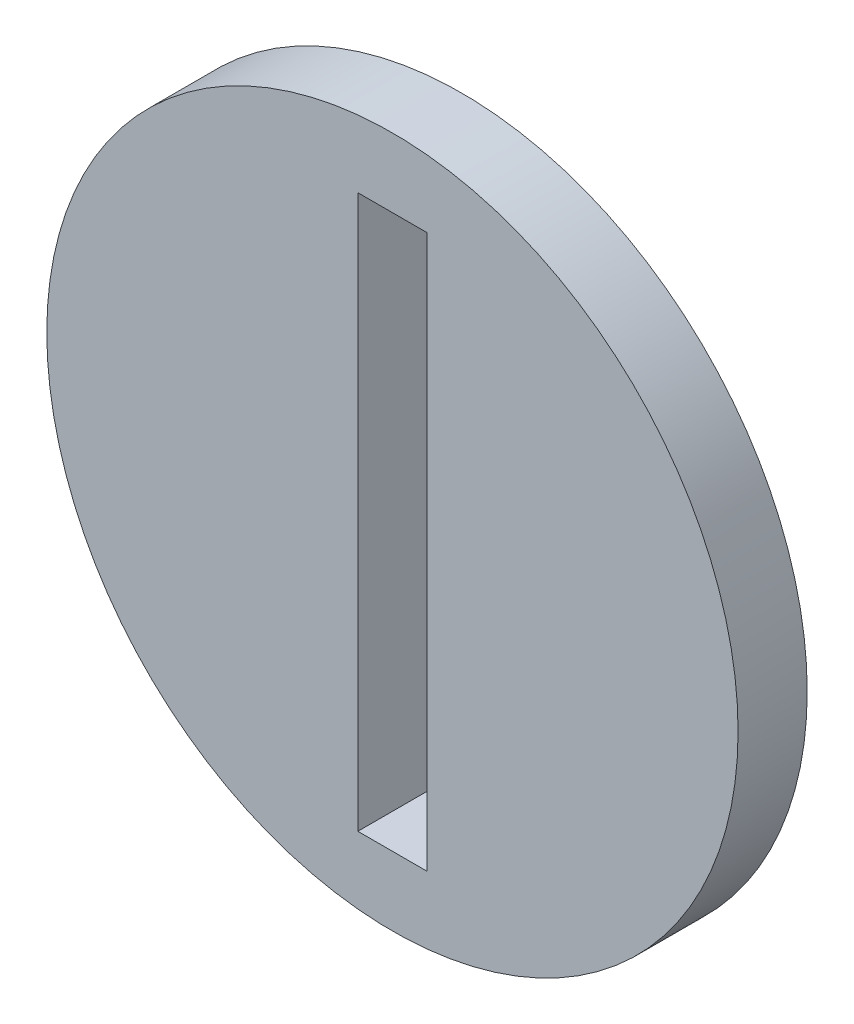
ISO-10303-21;
HEADER;
FILE_DESCRIPTION(('STEP AP214'),'2;1');
FILE_NAME('part.step','',(''),(''),'','','');
FILE_SCHEMA(('AUTOMOTIVE_DESIGN { 1 0 10303 214 1 1 1 1 }'));
ENDSEC;
DATA;
#1=APPLICATION_CONTEXT('core data for automotive mechanical design processes');
#2=APPLICATION_PROTOCOL_DEFINITION('international standard','automotive_design',2000,#1);
#3=PRODUCT_CONTEXT('',#1,'mechanical');
#4=PRODUCT('Part','Part','',(#3));
#5=PRODUCT_RELATED_PRODUCT_CATEGORY('part','',(#4));
#6=PRODUCT_DEFINITION_FORMATION('','',#4);
#7=PRODUCT_DEFINITION_CONTEXT('part definition',#1,'design');
#8=PRODUCT_DEFINITION('design','',#6,#7);
#9=PRODUCT_DEFINITION_SHAPE('','',#8);
#10=(LENGTH_UNIT() NAMED_UNIT(*) SI_UNIT(.MILLI.,.METRE.));
#11=(NAMED_UNIT(*) PLANE_ANGLE_UNIT() SI_UNIT($,.RADIAN.));
#12=(NAMED_UNIT(*) SI_UNIT($,.STERADIAN.) SOLID_ANGLE_UNIT());
#13=UNCERTAINTY_MEASURE_WITH_UNIT(LENGTH_MEASURE(1.E-05),#10,'distance_accuracy_value','');
#14=(GEOMETRIC_REPRESENTATION_CONTEXT(3) GLOBAL_UNCERTAINTY_ASSIGNED_CONTEXT((#13)) GLOBAL_UNIT_ASSIGNED_CONTEXT((#10,
#11,#12)) REPRESENTATION_CONTEXT('',''));
#15=CARTESIAN_POINT('',(0.,0.,0.));
#16=DIRECTION('',(0.,0.,1.));
#17=DIRECTION('',(1.,0.,0.));
#18=AXIS2_PLACEMENT_3D('',#15,#16,#17);
#19=CARTESIAN_POINT('',(0.,0.,3.175));
#20=DIRECTION('',(0.,0.,1.));
#21=DIRECTION('',(1.,0.,0.));
#22=AXIS2_PLACEMENT_3D('',#19,#20,#21);
#23=PLANE('',#22);
#24=CARTESIAN_POINT('',(0.,0.,3.175));
#25=DIRECTION('',(0.,0.,1.));
#26=DIRECTION('',(1.,0.,0.));
#27=AXIS2_PLACEMENT_3D('',#24,#25,#26);
#28=CIRCLE('',#27,15.875);
#29=CARTESIAN_POINT('',(15.875,0.,3.175));
#30=VERTEX_POINT('',#29);
#31=EDGE_CURVE('E11',#30,#30,#28,.T.);
#32=ORIENTED_EDGE('',*,*,#31,.T.);
#33=EDGE_LOOP('',(#32));
#34=FACE_BOUND('',#33,.T.);
#35=DIRECTION('',(1.,0.,0.));
#36=VECTOR('',#35,1.);
#37=CARTESIAN_POINT('',(-1.58749999999999,-12.7,3.175));
#38=LINE('',#37,#36);
#39=CARTESIAN_POINT('',(-1.58749999999999,-12.7,3.175));
#40=VERTEX_POINT('',#39);
#41=CARTESIAN_POINT('',(1.5875,-12.7,3.175));
#42=VERTEX_POINT('',#41);
#43=EDGE_CURVE('E83',#40,#42,#38,.T.);
#44=ORIENTED_EDGE('',*,*,#43,.F.);
#45=DIRECTION('',(0.,-1.,0.));
#46=VECTOR('',#45,1.);
#47=CARTESIAN_POINT('',(-1.58750000000001,12.7,3.175));
#48=LINE('',#47,#46);
#49=CARTESIAN_POINT('',(-1.58750000000001,12.7,3.175));
#50=VERTEX_POINT('',#49);
#51=EDGE_CURVE('E75',#50,#40,#48,.T.);
#52=ORIENTED_EDGE('',*,*,#51,.F.);
#53=DIRECTION('',(-1.,0.,0.));
#54=VECTOR('',#53,1.);
#55=CARTESIAN_POINT('',(-1.58750000000001,12.7,3.175));
#56=LINE('',#55,#54);
#57=CARTESIAN_POINT('',(1.5875,12.7,3.175));
#58=VERTEX_POINT('',#57);
#59=EDGE_CURVE('E96',#58,#50,#56,.T.);
#60=ORIENTED_EDGE('',*,*,#59,.F.);
#61=DIRECTION('',(0.,1.,0.));
#62=VECTOR('',#61,1.);
#63=CARTESIAN_POINT('',(1.5875,12.7,3.175));
#64=LINE('',#63,#62);
#65=EDGE_CURVE('E94',#42,#58,#64,.T.);
#66=ORIENTED_EDGE('',*,*,#65,.F.);
#67=EDGE_LOOP('',(#44,#52,#60,#66));
#68=FACE_BOUND('',#67,.T.);
#69=ADVANCED_FACE('F34',(#34,#68),#23,.T.);
#70=CARTESIAN_POINT('',(0.,0.,0.));
#71=DIRECTION('',(0.,0.,1.));
#72=DIRECTION('',(1.,0.,0.));
#73=AXIS2_PLACEMENT_3D('',#70,#71,#72);
#74=PLANE('',#73);
#75=CARTESIAN_POINT('',(0.,0.,0.));
#76=DIRECTION('',(0.,0.,1.));
#77=DIRECTION('',(1.,0.,0.));
#78=AXIS2_PLACEMENT_3D('',#75,#76,#77);
#79=CIRCLE('',#78,15.875);
#80=CARTESIAN_POINT('',(15.875,0.,0.));
#81=VERTEX_POINT('',#80);
#82=EDGE_CURVE('E38',#81,#81,#79,.T.);
#83=ORIENTED_EDGE('',*,*,#82,.F.);
#84=EDGE_LOOP('',(#83));
#85=FACE_BOUND('',#84,.T.);
#86=DIRECTION('',(0.,-1.,0.));
#87=VECTOR('',#86,1.);
#88=CARTESIAN_POINT('',(-1.58750000000001,12.7,0.));
#89=LINE('',#88,#87);
#90=CARTESIAN_POINT('',(-1.58750000000001,12.7,0.));
#91=VERTEX_POINT('',#90);
#92=CARTESIAN_POINT('',(-1.58749999999999,-12.7,0.));
#93=VERTEX_POINT('',#92);
#94=EDGE_CURVE('E57',#91,#93,#89,.T.);
#95=ORIENTED_EDGE('',*,*,#94,.T.);
#96=DIRECTION('',(1.,0.,0.));
#97=VECTOR('',#96,1.);
#98=CARTESIAN_POINT('',(-1.58749999999999,-12.7,0.));
#99=LINE('',#98,#97);
#100=CARTESIAN_POINT('',(1.5875,-12.7,0.));
#101=VERTEX_POINT('',#100);
#102=EDGE_CURVE('E90',#93,#101,#99,.T.);
#103=ORIENTED_EDGE('',*,*,#102,.T.);
#104=DIRECTION('',(0.,1.,0.));
#105=VECTOR('',#104,1.);
#106=CARTESIAN_POINT('',(1.5875,12.7,0.));
#107=LINE('',#106,#105);
#108=CARTESIAN_POINT('',(1.5875,12.7,0.));
#109=VERTEX_POINT('',#108);
#110=EDGE_CURVE('E102',#101,#109,#107,.T.);
#111=ORIENTED_EDGE('',*,*,#110,.T.);
#112=DIRECTION('',(-1.,0.,0.));
#113=VECTOR('',#112,1.);
#114=CARTESIAN_POINT('',(-1.58750000000001,12.7,0.));
#115=LINE('',#114,#113);
#116=EDGE_CURVE('E84',#109,#91,#115,.T.);
#117=ORIENTED_EDGE('',*,*,#116,.T.);
#118=EDGE_LOOP('',(#95,#103,#111,#117));
#119=FACE_BOUND('',#118,.T.);
#120=ADVANCED_FACE('F113',(#85,#119),#74,.F.);
#121=CARTESIAN_POINT('',(0.,0.,3.175));
#122=DIRECTION('',(0.,0.,-1.));
#123=DIRECTION('',(-1.,0.,0.));
#124=AXIS2_PLACEMENT_3D('',#121,#122,#123);
#125=CYLINDRICAL_SURFACE('',#124,15.875);
#126=ORIENTED_EDGE('',*,*,#31,.F.);
#127=EDGE_LOOP('',(#126));
#128=FACE_BOUND('',#127,.T.);
#129=ORIENTED_EDGE('',*,*,#82,.T.);
#130=EDGE_LOOP('',(#129));
#131=FACE_BOUND('',#130,.T.);
#132=ADVANCED_FACE('F36',(#128,#131),#125,.T.);
#133=CARTESIAN_POINT('',(-1.58750000000001,12.7,3.175));
#134=DIRECTION('',(1.,0.,0.));
#135=DIRECTION('',(0.,1.,0.));
#136=AXIS2_PLACEMENT_3D('',#133,#134,#135);
#137=PLANE('',#136);
#138=ORIENTED_EDGE('',*,*,#94,.F.);
#139=DIRECTION('',(0.,0.,-1.));
#140=VECTOR('',#139,1.);
#141=CARTESIAN_POINT('',(-1.58750000000001,12.7,3.175));
#142=LINE('',#141,#140);
#143=EDGE_CURVE('E79',#50,#91,#142,.T.);
#144=ORIENTED_EDGE('',*,*,#143,.F.);
#145=ORIENTED_EDGE('',*,*,#51,.T.);
#146=DIRECTION('',(0.,0.,-1.));
#147=VECTOR('',#146,1.);
#148=CARTESIAN_POINT('',(-1.58749999999999,-12.7,3.175));
#149=LINE('',#148,#147);
#150=EDGE_CURVE('E78',#40,#93,#149,.T.);
#151=ORIENTED_EDGE('',*,*,#150,.T.);
#152=EDGE_LOOP('',(#138,#144,#145,#151));
#153=FACE_BOUND('',#152,.T.);
#154=ADVANCED_FACE('F77',(#153),#137,.T.);
#155=CARTESIAN_POINT('',(-1.58749999999999,-12.7,3.175));
#156=DIRECTION('',(0.,1.,0.));
#157=DIRECTION('',(0.,0.,1.));
#158=AXIS2_PLACEMENT_3D('',#155,#156,#157);
#159=PLANE('',#158);
#160=ORIENTED_EDGE('',*,*,#102,.F.);
#161=ORIENTED_EDGE('',*,*,#150,.F.);
#162=ORIENTED_EDGE('',*,*,#43,.T.);
#163=DIRECTION('',(0.,0.,-1.));
#164=VECTOR('',#163,1.);
#165=CARTESIAN_POINT('',(1.5875,-12.7,3.175));
#166=LINE('',#165,#164);
#167=EDGE_CURVE('E91',#42,#101,#166,.T.);
#168=ORIENTED_EDGE('',*,*,#167,.T.);
#169=EDGE_LOOP('',(#160,#161,#162,#168));
#170=FACE_BOUND('',#169,.T.);
#171=ADVANCED_FACE('F87',(#170),#159,.T.);
#172=CARTESIAN_POINT('',(1.5875,12.7,3.175));
#173=DIRECTION('',(-1.,0.,0.));
#174=DIRECTION('',(0.,0.,1.));
#175=AXIS2_PLACEMENT_3D('',#172,#173,#174);
#176=PLANE('',#175);
#177=ORIENTED_EDGE('',*,*,#110,.F.);
#178=ORIENTED_EDGE('',*,*,#167,.F.);
#179=ORIENTED_EDGE('',*,*,#65,.T.);
#180=DIRECTION('',(0.,0.,-1.));
#181=VECTOR('',#180,1.);
#182=CARTESIAN_POINT('',(1.5875,12.7,3.175));
#183=LINE('',#182,#181);
#184=EDGE_CURVE('E49',#58,#109,#183,.T.);
#185=ORIENTED_EDGE('',*,*,#184,.T.);
#186=EDGE_LOOP('',(#177,#178,#179,#185));
#187=FACE_BOUND('',#186,.T.);
#188=ADVANCED_FACE('F111',(#187),#176,.T.);
#189=CARTESIAN_POINT('',(-1.58750000000001,12.7,3.175));
#190=DIRECTION('',(0.,-1.,0.));
#191=DIRECTION('',(1.,0.,0.));
#192=AXIS2_PLACEMENT_3D('',#189,#190,#191);
#193=PLANE('',#192);
#194=ORIENTED_EDGE('',*,*,#116,.F.);
#195=ORIENTED_EDGE('',*,*,#184,.F.);
#196=ORIENTED_EDGE('',*,*,#59,.T.);
#197=ORIENTED_EDGE('',*,*,#143,.T.);
#198=EDGE_LOOP('',(#194,#195,#196,#197));
#199=FACE_BOUND('',#198,.T.);
#200=ADVANCED_FACE('F114',(#199),#193,.T.);
#201=CLOSED_SHELL('',(#69,#120,#132,#154,#171,#188,#200));
#202=MANIFOLD_SOLID_BREP('B2',#201);
#203=ADVANCED_BREP_SHAPE_REPRESENTATION('',(#18,#202),#14);
#204=SHAPE_DEFINITION_REPRESENTATION(#9,#203);
ENDSEC;
END-ISO-10303-21;
